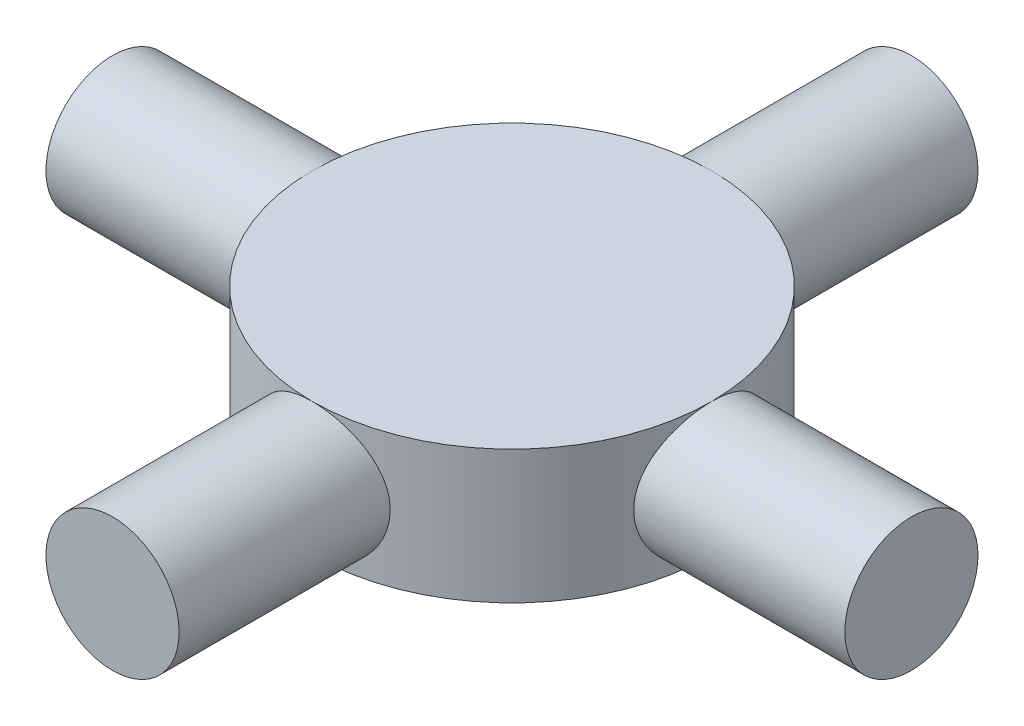
ISO-10303-21;
HEADER;
FILE_DESCRIPTION(('STEP AP214'),'2;1');
FILE_NAME('part.step','',(''),(''),'','','');
FILE_SCHEMA(('AUTOMOTIVE_DESIGN { 1 0 10303 214 1 1 1 1 }'));
ENDSEC;
DATA;
#1=APPLICATION_CONTEXT('core data for automotive mechanical design processes');
#2=APPLICATION_PROTOCOL_DEFINITION('international standard','automotive_design',2000,#1);
#3=PRODUCT_CONTEXT('',#1,'mechanical');
#4=PRODUCT('Part','Part','',(#3));
#5=PRODUCT_RELATED_PRODUCT_CATEGORY('part','',(#4));
#6=PRODUCT_DEFINITION_FORMATION('','',#4);
#7=PRODUCT_DEFINITION_CONTEXT('part definition',#1,'design');
#8=PRODUCT_DEFINITION('design','',#6,#7);
#9=PRODUCT_DEFINITION_SHAPE('','',#8);
#10=(LENGTH_UNIT() NAMED_UNIT(*) SI_UNIT(.MILLI.,.METRE.));
#11=(NAMED_UNIT(*) PLANE_ANGLE_UNIT() SI_UNIT($,.RADIAN.));
#12=(NAMED_UNIT(*) SI_UNIT($,.STERADIAN.) SOLID_ANGLE_UNIT());
#13=UNCERTAINTY_MEASURE_WITH_UNIT(LENGTH_MEASURE(1.E-05),#10,'distance_accuracy_value','');
#14=(GEOMETRIC_REPRESENTATION_CONTEXT(3) GLOBAL_UNCERTAINTY_ASSIGNED_CONTEXT((#13)) GLOBAL_UNIT_ASSIGNED_CONTEXT((#10,
#11,#12)) REPRESENTATION_CONTEXT('',''));
#15=CARTESIAN_POINT('',(0.,0.,0.));
#16=DIRECTION('',(0.,0.,1.));
#17=DIRECTION('',(1.,0.,0.));
#18=AXIS2_PLACEMENT_3D('',#15,#16,#17);
#19=CARTESIAN_POINT('',(0.,0.,60.));
#20=DIRECTION('',(0.,0.,-1.));
#21=DIRECTION('',(-1.,0.,0.));
#22=AXIS2_PLACEMENT_3D('',#19,#20,#21);
#23=CYLINDRICAL_SURFACE('',#22,5.);
#24=CARTESIAN_POINT('',(-5.,0.,15.8578643762691));
#25=CARTESIAN_POINT('',(-5.00000128973856,0.27234087418036,15.8578652734783));
#26=CARTESIAN_POINT('',(-4.97767391842761,0.544673999117963,15.8499115354571));
#27=CARTESIAN_POINT('',(-4.88925565844404,1.08127210497125,15.8191212959373));
#28=CARTESIAN_POINT('',(-4.82315756084198,1.34553574936235,15.7962823428906));
#29=CARTESIAN_POINT('',(-4.64977742842452,1.85813446498644,15.7385898155604));
#30=CARTESIAN_POINT('',(-4.54257610701623,2.10649964721358,15.7037598014339));
#31=CARTESIAN_POINT('',(-4.2903081422069,2.58180024273981,15.6260438994838));
#32=CARTESIAN_POINT('',(-4.14523314430091,2.80873091276816,15.5831562348194));
#33=CARTESIAN_POINT('',(-3.81525573221439,3.24359981169157,15.4922755296263));
#34=CARTESIAN_POINT('',(-3.62912170688959,3.45057714335864,15.4441552577678));
#35=CARTESIAN_POINT('',(-3.22493833607197,3.83103400612319,15.3493067599499));
#36=CARTESIAN_POINT('',(-3.00688387526188,4.00450815791185,15.3025787585519));
#37=CARTESIAN_POINT('',(-2.53802253982505,4.31739448664797,15.2143066539101));
#38=CARTESIAN_POINT('',(-2.28650955612262,4.45579985308979,15.1729296149197));
#39=CARTESIAN_POINT('',(-1.76215611493737,4.68795792563755,15.1015206614509));
#40=CARTESIAN_POINT('',(-1.48932142843606,4.78172266588453,15.0714856898499));
#41=CARTESIAN_POINT('',(-0.940144087167473,4.91867927316196,15.0270462284047));
#42=CARTESIAN_POINT('',(-0.664253774264843,4.96351723128503,15.012134261122));
#43=CARTESIAN_POINT('',(-0.108489374120448,5.0065814668033,14.9978195890876));
#44=CARTESIAN_POINT('',(0.171383667719481,5.00481975826206,14.9984128868552));
#45=CARTESIAN_POINT('',(0.715517575969073,4.95577872716986,15.0146980190634));
#46=CARTESIAN_POINT('',(0.979960242958282,4.91028735762756,15.0297967622441));
#47=CARTESIAN_POINT('',(1.49721719411086,4.77803509509764,15.0726516330134));
#48=CARTESIAN_POINT('',(1.75003068889608,4.69127140510087,15.1004086184409));
#49=CARTESIAN_POINT('',(2.24076237420986,4.4778934134697,15.1662164853388));
#50=CARTESIAN_POINT('',(2.47844110484422,4.35077030726744,15.2043978737992));
#51=CARTESIAN_POINT('',(2.92962162763661,4.06070147275672,15.287080348054));
#52=CARTESIAN_POINT('',(3.14311667192671,3.89774578336185,15.3315831899267));
#53=CARTESIAN_POINT('',(3.55050433275654,3.53162803270151,15.4246904075052));
#54=CARTESIAN_POINT('',(3.74300078532636,3.32693421079259,15.4733892415561));
#55=CARTESIAN_POINT('',(4.09138629799087,2.88775637136691,15.567633237555));
#56=CARTESIAN_POINT('',(4.24726971640771,2.65326777135978,15.6131779127192));
#57=CARTESIAN_POINT('',(4.51993727517871,2.1567318719828,15.6964737439444));
#58=CARTESIAN_POINT('',(4.6361323181067,1.89433934341113,15.7341045357626));
#59=CARTESIAN_POINT('',(4.82221596634668,1.35214302892791,15.7959174587808));
#60=CARTESIAN_POINT('',(4.89212397873747,1.07234659396877,15.8201052256454));
#61=CARTESIAN_POINT('',(4.98080641048761,0.516808222942129,15.8510181842207));
#62=CARTESIAN_POINT('',(5.00174547753816,0.241452876256721,15.8584819840622));
#63=CARTESIAN_POINT('',(4.99802719454859,-0.308880745570532,15.8571663970408));
#64=CARTESIAN_POINT('',(4.97337812613381,-0.583859080119941,15.8483899604093));
#65=CARTESIAN_POINT('',(4.88112825776155,-1.11578482855955,15.816319095485));
#66=CARTESIAN_POINT('',(4.81503196990342,-1.3730271507542,15.793533727958));
#67=CARTESIAN_POINT('',(4.64356931280233,-1.87271803119592,15.7365723164489));
#68=CARTESIAN_POINT('',(4.53819598181711,-2.1151639579539,15.702394253258));
#69=CARTESIAN_POINT('',(4.28737170369468,-2.58690210423499,15.6251561202107));
#70=CARTESIAN_POINT('',(4.14075559179248,-2.81553321320901,15.5818487167186));
#71=CARTESIAN_POINT('',(3.81292815278779,-3.24573026191859,15.4917115634517));
#72=CARTESIAN_POINT('',(3.63170662749391,-3.4472881933061,15.4448807778103));
#73=CARTESIAN_POINT('',(3.22945852950163,-3.82763992045319,15.3502480681075));
#74=CARTESIAN_POINT('',(3.00693635273326,-4.00487195009425,15.3025078211052));
#75=CARTESIAN_POINT('',(2.53413645700128,-4.31958071174021,15.2136574193446));
#76=CARTESIAN_POINT('',(2.28385972432276,-4.45705885581212,15.1725470291153));
#77=CARTESIAN_POINT('',(1.76389931216148,-4.68710052430857,15.1017797094699));
#78=CARTESIAN_POINT('',(1.49435561660598,-4.77995638574033,15.0720484997734));
#79=CARTESIAN_POINT('',(0.942292329230082,-4.91863871030052,15.0270694581113));
#80=CARTESIAN_POINT('',(0.659777459769448,-4.96448214940251,15.0118163982991));
#81=CARTESIAN_POINT('',(0.104076679300206,-5.00631038802821,14.9979068381872));
#82=CARTESIAN_POINT('',(-0.168923619600091,-5.00453726966188,14.998503995528));
#83=CARTESIAN_POINT('',(-0.710555725000868,-4.95671345926795,15.0143901740301));
#84=CARTESIAN_POINT('',(-0.979187884095283,-4.91066635923615,15.0296780033212));
#85=CARTESIAN_POINT('',(-1.50021059716029,-4.77708882712019,15.0729542522794));
#86=CARTESIAN_POINT('',(-1.75279135456394,-4.69022892323534,15.1007370819426));
#87=CARTESIAN_POINT('',(-2.23989175469898,-4.47811234451422,15.1661419647753));
#88=CARTESIAN_POINT('',(-2.47440812071216,-4.35284872401493,15.2037657975992));
#89=CARTESIAN_POINT('',(-2.92817008154393,-4.06215243948996,15.286706558606));
#90=CARTESIAN_POINT('',(-3.14653125778803,-3.8954065730918,15.3322563754037));
#91=CARTESIAN_POINT('',(-3.55290513136213,-3.52871304421903,15.425350560406));
#92=CARTESIAN_POINT('',(-3.74090810812296,-3.32875478868636,15.4728955613451));
#93=CARTESIAN_POINT('',(-4.08870904416559,-2.89195322206526,15.5668360087201));
#94=CARTESIAN_POINT('',(-4.2471148299895,-2.6539724451168,15.6131136005685));
#95=CARTESIAN_POINT('',(-4.52157171650557,-2.1533278654861,15.6969903338492));
#96=CARTESIAN_POINT('',(-4.63763388409737,-1.89067053485168,15.7345917419375));
#97=CARTESIAN_POINT('',(-4.81921914102083,-1.36019087992184,15.7949332896743));
#98=CARTESIAN_POINT('',(-4.8867895457476,-1.09313868237317,15.8182683571409));
#99=CARTESIAN_POINT('',(-4.97717160074633,-0.550719747666494,15.8497308230241));
#100=CARTESIAN_POINT('',(-4.99999869598296,-0.275355912946455,15.8578634691269));
#101=CARTESIAN_POINT('',(-5.,0.,15.8578643762691));
#102=B_SPLINE_CURVE_WITH_KNOTS('',3,(#24,#25,#26,#27,#28,#29,#30,#31,#32,#33,#34,#35,#36,#37,
#38,#39,#40,#41,#42,#43,#44,#45,#46,#47,#48,#49,#50,#51,#52,#53,#54,#55,#56,#57,#58,#59,#60,#61,
#62,#63,#64,#65,#66,#67,#68,#69,#70,#71,#72,#73,#74,#75,#76,#77,#78,#79,#80,#81,#82,#83,#84,#85,
#86,#87,#88,#89,#90,#91,#92,#93,#94,#95,#96,#97,#98,#99,#100,#101),.UNSPECIFIED.,.T.,.F.,(4,2,2,
2,2,2,2,2,2,2,2,2,2,2,2,2,2,2,2,2,2,2,2,2,2,2,2,2,2,2,2,2,2,2,2,2,2,2,4),(0.,0.816002923996779,
1.63214027507582,2.44668313750414,3.26140583092721,4.10506687137841,4.9488632585994,
5.81467530718285,6.68025381933945,7.51571593824671,8.35096266511636,9.15345024127845,
9.95599220946183,10.7690827430167,11.5823995937011,12.4340087181959,13.2857489806053,
14.1496319921528,15.0131525678308,15.837714568222,16.6621267918617,17.4582197884388,
18.2544539573473,19.0759428867857,19.8976742831064,20.7589404085546,21.6201759378766,
22.4756895595426,23.3308941502078,24.1459042338818,24.9608482004891,25.7628478020215,
26.5649925381621,27.3967759760317,28.2288252216316,29.0934451368072,29.9578389133433,
30.7831606081345,31.6081973595232),.UNSPECIFIED.);
#103=CARTESIAN_POINT('',(0.,-5.,15.));
#104=VERTEX_POINT('',#103);
#105=CARTESIAN_POINT('',(0.,5.,15.));
#106=VERTEX_POINT('',#105);
#107=EDGE_CURVE('E122',#104,#106,#102,.T.);
#108=ORIENTED_EDGE('',*,*,#107,.T.);
#109=EDGE_CURVE('E135',#106,#104,#102,.T.);
#110=ORIENTED_EDGE('',*,*,#109,.T.);
#111=EDGE_LOOP('',(#108,#110));
#112=FACE_BOUND('',#111,.T.);
#113=CARTESIAN_POINT('',(0.,0.,0.));
#114=DIRECTION('',(0.,0.,1.));
#115=DIRECTION('',(1.,0.,0.));
#116=AXIS2_PLACEMENT_3D('',#113,#114,#115);
#117=CIRCLE('',#116,5.);
#118=CARTESIAN_POINT('',(5.,0.,0.));
#119=VERTEX_POINT('',#118);
#120=EDGE_CURVE('E125',#119,#119,#117,.T.);
#121=ORIENTED_EDGE('',*,*,#120,.T.);
#122=EDGE_LOOP('',(#121));
#123=FACE_BOUND('',#122,.T.);
#124=ADVANCED_FACE('F34',(#112,#123),#23,.T.);
#125=CARTESIAN_POINT('',(0.,0.,0.));
#126=DIRECTION('',(0.,0.,1.));
#127=DIRECTION('',(1.,0.,0.));
#128=AXIS2_PLACEMENT_3D('',#125,#126,#127);
#129=PLANE('',#128);
#130=ORIENTED_EDGE('',*,*,#120,.F.);
#131=EDGE_LOOP('',(#130));
#132=FACE_BOUND('',#131,.T.);
#133=ADVANCED_FACE('F112',(#132),#129,.F.);
#134=CARTESIAN_POINT('',(0.,-5.,30.));
#135=DIRECTION('',(0.,1.,0.));
#136=DIRECTION('',(0.,0.,1.));
#137=AXIS2_PLACEMENT_3D('',#134,#135,#136);
#138=CYLINDRICAL_SURFACE('',#137,15.);
#139=ORIENTED_EDGE('',*,*,#109,.F.);
#140=CARTESIAN_POINT('',(0.,5.,30.));
#141=DIRECTION('',(0.,1.,0.));
#142=DIRECTION('',(0.,0.,1.));
#143=AXIS2_PLACEMENT_3D('',#140,#141,#142);
#144=CIRCLE('',#143,15.);
#145=CARTESIAN_POINT('',(15.,5.,30.));
#146=VERTEX_POINT('',#145);
#147=EDGE_CURVE('E53',#146,#106,#144,.T.);
#148=ORIENTED_EDGE('',*,*,#147,.F.);
#149=CARTESIAN_POINT('',(14.142135623731,0.,25.));
#150=CARTESIAN_POINT('',(14.1421347265217,-0.272340874180355,24.9999987102614));
#151=CARTESIAN_POINT('',(14.1500884645429,-0.544673999117958,25.0223260815724));
#152=CARTESIAN_POINT('',(14.1808787040627,-1.08127210497124,25.110744341556));
#153=CARTESIAN_POINT('',(14.2037176571094,-1.34553574936234,25.176842439158));
#154=CARTESIAN_POINT('',(14.2614101844396,-1.85813446498643,25.3502225715755));
#155=CARTESIAN_POINT('',(14.2962401985661,-2.10649964721358,25.4574238929838));
#156=CARTESIAN_POINT('',(14.3739561005162,-2.5818002427398,25.7096918577931));
#157=CARTESIAN_POINT('',(14.4168437651806,-2.80873091276815,25.8547668556991));
#158=CARTESIAN_POINT('',(14.5077244703737,-3.24359981169156,26.1847442677856));
#159=CARTESIAN_POINT('',(14.5558447422322,-3.45057714335863,26.3708782931104));
#160=CARTESIAN_POINT('',(14.6506932400501,-3.83103400612319,26.775061663928));
#161=CARTESIAN_POINT('',(14.6974212414481,-4.00450815791184,26.9931161247381));
#162=CARTESIAN_POINT('',(14.7856933460899,-4.31739448664796,27.4619774601749));
#163=CARTESIAN_POINT('',(14.8270703850803,-4.45579985308978,27.7134904438774));
#164=CARTESIAN_POINT('',(14.8984793385491,-4.68795792563754,28.2378438850626));
#165=CARTESIAN_POINT('',(14.9285143101501,-4.78172266588452,28.5106785715639));
#166=CARTESIAN_POINT('',(14.9729537715953,-4.91867927316196,29.0598559128325));
#167=CARTESIAN_POINT('',(14.987865738878,-4.96351723128503,29.3357462257352));
#168=CARTESIAN_POINT('',(15.0021804109124,-5.00658146680329,29.8915106258795));
#169=CARTESIAN_POINT('',(15.0015871131448,-5.00481975826206,30.1713836677195));
#170=CARTESIAN_POINT('',(14.9853019809366,-4.95577872716985,30.7155175759691));
#171=CARTESIAN_POINT('',(14.9702032377559,-4.91028735762755,30.9799602429583));
#172=CARTESIAN_POINT('',(14.9273483669866,-4.77803509509763,31.4972171941109));
#173=CARTESIAN_POINT('',(14.8995913815591,-4.69127140510087,31.7500306888961));
#174=CARTESIAN_POINT('',(14.8337835146612,-4.4778934134697,32.2407623742099));
#175=CARTESIAN_POINT('',(14.7956021262008,-4.35077030726744,32.4784411048442));
#176=CARTESIAN_POINT('',(14.712919651946,-4.06070147275671,32.9296216276366));
#177=CARTESIAN_POINT('',(14.6684168100733,-3.89774578336184,33.1431166719267));
#178=CARTESIAN_POINT('',(14.5753095924948,-3.5316280327015,33.5505043327565));
#179=CARTESIAN_POINT('',(14.5266107584439,-3.32693421079259,33.7430007853264));
#180=CARTESIAN_POINT('',(14.432366762445,-2.8877563713669,34.0913862979909));
#181=CARTESIAN_POINT('',(14.3868220872808,-2.65326777135977,34.2472697164077));
#182=CARTESIAN_POINT('',(14.3035262560556,-2.1567318719828,34.5199372751787));
#183=CARTESIAN_POINT('',(14.2658954642374,-1.89433934341113,34.6361323181067));
#184=CARTESIAN_POINT('',(14.2040825412192,-1.35214302892791,34.8222159663467));
#185=CARTESIAN_POINT('',(14.1798947743546,-1.07234659396877,34.8921239787375));
#186=CARTESIAN_POINT('',(14.1489818157793,-0.516808222942124,34.9808064104876));
#187=CARTESIAN_POINT('',(14.1415180159378,-0.241452876256715,35.0017454775382));
#188=CARTESIAN_POINT('',(14.1428336029592,0.308880745570538,34.9980271945486));
#189=CARTESIAN_POINT('',(14.1516100395907,0.583859080119946,34.9733781261338));
#190=CARTESIAN_POINT('',(14.183680904515,1.11578482855955,34.8811282577615));
#191=CARTESIAN_POINT('',(14.206466272042,1.37302715075421,34.8150319699034));
#192=CARTESIAN_POINT('',(14.2634276835511,1.87271803119593,34.6435693128023));
#193=CARTESIAN_POINT('',(14.297605746742,2.11516395795391,34.5381959818171));
#194=CARTESIAN_POINT('',(14.3748438797893,2.58690210423499,34.2873717036947));
#195=CARTESIAN_POINT('',(14.4181512832814,2.81553321320901,34.1407555917925));
#196=CARTESIAN_POINT('',(14.5082884365483,3.2457302619186,33.8129281527878));
#197=CARTESIAN_POINT('',(14.5551192221897,3.4472881933061,33.6317066274939));
#198=CARTESIAN_POINT('',(14.6497519318924,3.8276399204532,33.2294585295016));
#199=CARTESIAN_POINT('',(14.6974921788948,4.00487195009425,33.0069363527333));
#200=CARTESIAN_POINT('',(14.7863425806554,4.31958071174022,32.5341364570013));
#201=CARTESIAN_POINT('',(14.8274529708847,4.45705885581213,32.2838597243228));
#202=CARTESIAN_POINT('',(14.8982202905301,4.68710052430858,31.7638993121615));
#203=CARTESIAN_POINT('',(14.9279515002266,4.77995638574033,31.494355616606));
#204=CARTESIAN_POINT('',(14.9729305418887,4.91863871030053,30.9422923292301));
#205=CARTESIAN_POINT('',(14.9881836017009,4.96448214940252,30.6597774597694));
#206=CARTESIAN_POINT('',(15.0020931618128,5.00631038802822,30.1040766793002));
#207=CARTESIAN_POINT('',(15.001496004472,5.00453726966189,29.8310763803999));
#208=CARTESIAN_POINT('',(14.9856098259699,4.95671345926796,29.2894442749991));
#209=CARTESIAN_POINT('',(14.9703219966788,4.91066635923616,29.0208121159047));
#210=CARTESIAN_POINT('',(14.9270457477206,4.77708882712019,28.4997894028397));
#211=CARTESIAN_POINT('',(14.8992629180574,4.69022892323534,28.2472086454361));
#212=CARTESIAN_POINT('',(14.8338580352247,4.47811234451423,27.760108245301));
#213=CARTESIAN_POINT('',(14.7962342024008,4.35284872401494,27.5255918792878));
#214=CARTESIAN_POINT('',(14.713293441394,4.06215243948997,27.0718299184561));
#215=CARTESIAN_POINT('',(14.6677436245963,3.8954065730918,26.853468742212));
#216=CARTESIAN_POINT('',(14.574649439594,3.52871304421903,26.4470948686379));
#217=CARTESIAN_POINT('',(14.5271044386549,3.32875478868637,26.259091891877));
#218=CARTESIAN_POINT('',(14.4331639912799,2.89195322206526,25.9112909558344));
#219=CARTESIAN_POINT('',(14.3868863994315,2.65397244511681,25.7528851700105));
#220=CARTESIAN_POINT('',(14.3030096661508,2.15332786548611,25.4784282834944));
#221=CARTESIAN_POINT('',(14.2654082580625,1.89067053485168,25.3623661159026));
#222=CARTESIAN_POINT('',(14.2050667103257,1.36019087992184,25.1807808589792));
#223=CARTESIAN_POINT('',(14.1817316428591,1.09313868237317,25.1132104542524));
#224=CARTESIAN_POINT('',(14.1502691769759,0.550719747666498,25.0228283992537));
#225=CARTESIAN_POINT('',(14.1421365308731,0.27535591294646,25.000001304017));
#226=CARTESIAN_POINT('',(14.142135623731,0.,25.));
#227=B_SPLINE_CURVE_WITH_KNOTS('',3,(#149,#150,#151,#152,#153,#154,#155,#156,#157,#158,#159,
#160,#161,#162,#163,#164,#165,#166,#167,#168,#169,#170,#171,#172,#173,#174,#175,#176,#177,#178,
#179,#180,#181,#182,#183,#184,#185,#186,#187,#188,#189,#190,#191,#192,#193,#194,#195,#196,#197,
#198,#199,#200,#201,#202,#203,#204,#205,#206,#207,#208,#209,#210,#211,#212,#213,#214,#215,#216,
#217,#218,#219,#220,#221,#222,#223,#224,#225,#226),.UNSPECIFIED.,.T.,.F.,(4,2,2,2,2,2,2,2,2,2,2,
2,2,2,2,2,2,2,2,2,2,2,2,2,2,2,2,2,2,2,2,2,2,2,2,2,2,2,4),(0.,0.816002923996779,1.63214027507582,
2.44668313750414,3.26140583092721,4.1050668713784,4.9488632585994,5.81467530718285,
6.68025381933945,7.51571593824671,8.35096266511636,9.15345024127845,9.95599220946183,
10.7690827430168,11.5823995937011,12.4340087181959,13.2857489806053,14.1496319921528,
15.0131525678308,15.837714568222,16.6621267918617,17.4582197884388,18.2544539573473,
19.0759428867857,19.8976742831064,20.7589404085546,21.6201759378766,22.4756895595426,
23.3308941502078,24.1459042338818,24.9608482004891,25.7628478020215,26.5649925381621,
27.3967759760317,28.2288252216316,29.0934451368072,29.9578389133433,30.7831606081345,
31.6081973595232),.UNSPECIFIED.);
#228=CARTESIAN_POINT('',(15.,-5.,30.));
#229=VERTEX_POINT('',#228);
#230=EDGE_CURVE('E159',#146,#229,#227,.T.);
#231=ORIENTED_EDGE('',*,*,#230,.T.);
#232=CARTESIAN_POINT('',(0.,-5.,30.));
#233=DIRECTION('',(0.,1.,0.));
#234=DIRECTION('',(0.,0.,1.));
#235=AXIS2_PLACEMENT_3D('',#232,#233,#234);
#236=CIRCLE('',#235,15.);
#237=EDGE_CURVE('E189',#229,#104,#236,.T.);
#238=ORIENTED_EDGE('',*,*,#237,.T.);
#239=EDGE_LOOP('',(#139,#148,#231,#238));
#240=FACE_BOUND('',#239,.T.);
#241=ADVANCED_FACE('F117',(#240),#138,.T.);
#242=ORIENTED_EDGE('',*,*,#107,.F.);
#243=CARTESIAN_POINT('',(-15.0000000000004,-5.00000000000133,30.0000000000001));
#244=VERTEX_POINT('',#243);
#245=EDGE_CURVE('E185',#104,#244,#236,.T.);
#246=ORIENTED_EDGE('',*,*,#245,.T.);
#247=CARTESIAN_POINT('',(-14.142135623731,0.,25.));
#248=CARTESIAN_POINT('',(-14.1421347265217,0.272340874180365,24.9999987102614));
#249=CARTESIAN_POINT('',(-14.1500884645429,0.544673999117969,25.0223260815724));
#250=CARTESIAN_POINT('',(-14.1808787040627,1.08127210497125,25.110744341556));
#251=CARTESIAN_POINT('',(-14.2037176571094,1.34553574936235,25.176842439158));
#252=CARTESIAN_POINT('',(-14.2614101844396,1.85813446498644,25.3502225715755));
#253=CARTESIAN_POINT('',(-14.2962401985661,2.10649964721359,25.4574238929838));
#254=CARTESIAN_POINT('',(-14.3739561005162,2.58180024273981,25.7096918577931));
#255=CARTESIAN_POINT('',(-14.4168437651806,2.80873091276816,25.8547668556991));
#256=CARTESIAN_POINT('',(-14.5077244703737,3.24359981169157,26.1847442677856));
#257=CARTESIAN_POINT('',(-14.5558447422322,3.45057714335864,26.3708782931104));
#258=CARTESIAN_POINT('',(-14.6506932400501,3.8310340061232,26.775061663928));
#259=CARTESIAN_POINT('',(-14.6974212414481,4.00450815791185,26.9931161247381));
#260=CARTESIAN_POINT('',(-14.7856933460899,4.31739448664797,27.4619774601749));
#261=CARTESIAN_POINT('',(-14.8270703850803,4.45579985308979,27.7134904438774));
#262=CARTESIAN_POINT('',(-14.8984793385491,4.68795792563755,28.2378438850626));
#263=CARTESIAN_POINT('',(-14.9285143101501,4.78172266588453,28.5106785715639));
#264=CARTESIAN_POINT('',(-14.9729537715953,4.91867927316197,29.0598559128325));
#265=CARTESIAN_POINT('',(-14.987865738878,4.96351723128504,29.3357462257352));
#266=CARTESIAN_POINT('',(-15.0021804109124,5.0065814668033,29.8915106258795));
#267=CARTESIAN_POINT('',(-15.0015871131448,5.00481975826207,30.1713836677195));
#268=CARTESIAN_POINT('',(-14.9853019809366,4.95577872716986,30.7155175759691));
#269=CARTESIAN_POINT('',(-14.9702032377559,4.91028735762756,30.9799602429583));
#270=CARTESIAN_POINT('',(-14.9273483669866,4.77803509509764,31.4972171941109));
#271=CARTESIAN_POINT('',(-14.8995913815591,4.69127140510088,31.7500306888961));
#272=CARTESIAN_POINT('',(-14.8337835146612,4.47789341346971,32.2407623742099));
#273=CARTESIAN_POINT('',(-14.7956021262008,4.35077030726745,32.4784411048442));
#274=CARTESIAN_POINT('',(-14.712919651946,4.06070147275672,32.9296216276366));
#275=CARTESIAN_POINT('',(-14.6684168100733,3.89774578336185,33.1431166719267));
#276=CARTESIAN_POINT('',(-14.5753095924948,3.53162803270151,33.5505043327565));
#277=CARTESIAN_POINT('',(-14.5266107584439,3.3269342107926,33.7430007853264));
#278=CARTESIAN_POINT('',(-14.432366762445,2.88775637136691,34.0913862979909));
#279=CARTESIAN_POINT('',(-14.3868220872808,2.65326777135978,34.2472697164077));
#280=CARTESIAN_POINT('',(-14.3035262560556,2.15673187198281,34.5199372751787));
#281=CARTESIAN_POINT('',(-14.2658954642374,1.89433934341114,34.6361323181067));
#282=CARTESIAN_POINT('',(-14.2040825412192,1.35214302892792,34.8222159663467));
#283=CARTESIAN_POINT('',(-14.1798947743546,1.07234659396878,34.8921239787375));
#284=CARTESIAN_POINT('',(-14.1489818157793,0.516808222942135,34.9808064104876));
#285=CARTESIAN_POINT('',(-14.1415180159378,0.241452876256726,35.0017454775382));
#286=CARTESIAN_POINT('',(-14.1428336029592,-0.308880745570528,34.9980271945486));
#287=CARTESIAN_POINT('',(-14.1516100395907,-0.583859080119936,34.9733781261338));
#288=CARTESIAN_POINT('',(-14.183680904515,-1.11578482855954,34.8811282577615));
#289=CARTESIAN_POINT('',(-14.206466272042,-1.3730271507542,34.8150319699034));
#290=CARTESIAN_POINT('',(-14.2634276835511,-1.87271803119592,34.6435693128023));
#291=CARTESIAN_POINT('',(-14.297605746742,-2.1151639579539,34.5381959818171));
#292=CARTESIAN_POINT('',(-14.3748438797893,-2.58690210423498,34.2873717036947));
#293=CARTESIAN_POINT('',(-14.4181512832814,-2.815533213209,34.1407555917925));
#294=CARTESIAN_POINT('',(-14.5082884365483,-3.24573026191859,33.8129281527878));
#295=CARTESIAN_POINT('',(-14.5551192221897,-3.44728819330609,33.6317066274939));
#296=CARTESIAN_POINT('',(-14.6497519318924,-3.82763992045319,33.2294585295016));
#297=CARTESIAN_POINT('',(-14.6974921788948,-4.00487195009424,33.0069363527333));
#298=CARTESIAN_POINT('',(-14.7863425806554,-4.31958071174021,32.5341364570013));
#299=CARTESIAN_POINT('',(-14.8274529708847,-4.45705885581212,32.2838597243228));
#300=CARTESIAN_POINT('',(-14.8982202905301,-4.68710052430857,31.7638993121615));
#301=CARTESIAN_POINT('',(-14.9279515002266,-4.77995638574032,31.494355616606));
#302=CARTESIAN_POINT('',(-14.9729305418887,-4.91863871030052,30.9422923292301));
#303=CARTESIAN_POINT('',(-14.9881836017009,-4.96448214940251,30.6597774597694));
#304=CARTESIAN_POINT('',(-15.0020931618128,-5.00631038802821,30.1040766793002));
#305=CARTESIAN_POINT('',(-15.001496004472,-5.00453726966188,29.8310763803999));
#306=CARTESIAN_POINT('',(-14.9856098259699,-4.95671345926795,29.2894442749991));
#307=CARTESIAN_POINT('',(-14.9703219966788,-4.91066635923615,29.0208121159047));
#308=CARTESIAN_POINT('',(-14.9270457477206,-4.77708882712018,28.4997894028397));
#309=CARTESIAN_POINT('',(-14.8992629180574,-4.69022892323533,28.2472086454361));
#310=CARTESIAN_POINT('',(-14.8338580352247,-4.47811234451422,27.760108245301));
#311=CARTESIAN_POINT('',(-14.7962342024008,-4.35284872401493,27.5255918792878));
#312=CARTESIAN_POINT('',(-14.713293441394,-4.06215243948996,27.0718299184561));
#313=CARTESIAN_POINT('',(-14.6677436245963,-3.89540657309179,26.853468742212));
#314=CARTESIAN_POINT('',(-14.574649439594,-3.52871304421902,26.4470948686379));
#315=CARTESIAN_POINT('',(-14.5271044386549,-3.32875478868636,26.259091891877));
#316=CARTESIAN_POINT('',(-14.4331639912799,-2.89195322206525,25.9112909558344));
#317=CARTESIAN_POINT('',(-14.3868863994315,-2.65397244511679,25.7528851700105));
#318=CARTESIAN_POINT('',(-14.3030096661508,-2.1533278654861,25.4784282834944));
#319=CARTESIAN_POINT('',(-14.2654082580625,-1.89067053485167,25.3623661159026));
#320=CARTESIAN_POINT('',(-14.2050667103257,-1.36019087992183,25.1807808589792));
#321=CARTESIAN_POINT('',(-14.1817316428591,-1.09313868237316,25.1132104542524));
#322=CARTESIAN_POINT('',(-14.1502691769759,-0.550719747666487,25.0228283992537));
#323=CARTESIAN_POINT('',(-14.1421365308731,-0.275355912946449,25.000001304017));
#324=CARTESIAN_POINT('',(-14.142135623731,0.,25.));
#325=B_SPLINE_CURVE_WITH_KNOTS('',3,(#247,#248,#249,#250,#251,#252,#253,#254,#255,#256,#257,
#258,#259,#260,#261,#262,#263,#264,#265,#266,#267,#268,#269,#270,#271,#272,#273,#274,#275,#276,
#277,#278,#279,#280,#281,#282,#283,#284,#285,#286,#287,#288,#289,#290,#291,#292,#293,#294,#295,
#296,#297,#298,#299,#300,#301,#302,#303,#304,#305,#306,#307,#308,#309,#310,#311,#312,#313,#314,
#315,#316,#317,#318,#319,#320,#321,#322,#323,#324),.UNSPECIFIED.,.T.,.F.,(4,2,2,2,2,2,2,2,2,2,2,
2,2,2,2,2,2,2,2,2,2,2,2,2,2,2,2,2,2,2,2,2,2,2,2,2,2,2,4),(0.,0.816002923996779,1.63214027507582,
2.44668313750414,3.26140583092721,4.1050668713784,4.9488632585994,5.81467530718285,
6.68025381933945,7.51571593824671,8.35096266511636,9.15345024127845,9.95599220946183,
10.7690827430168,11.5823995937011,12.4340087181959,13.2857489806053,14.1496319921528,
15.0131525678308,15.837714568222,16.6621267918617,17.4582197884388,18.2544539573473,
19.0759428867857,19.8976742831064,20.7589404085546,21.6201759378766,22.4756895595426,
23.3308941502078,24.1459042338818,24.9608482004891,25.7628478020215,26.5649925381621,
27.3967759760317,28.2288252216316,29.0934451368072,29.9578389133433,30.7831606081345,
31.6081973595232),.UNSPECIFIED.);
#326=CARTESIAN_POINT('',(-15.,5.,30.));
#327=VERTEX_POINT('',#326);
#328=EDGE_CURVE('E60',#244,#327,#325,.T.);
#329=ORIENTED_EDGE('',*,*,#328,.T.);
#330=EDGE_CURVE('E93',#106,#327,#144,.T.);
#331=ORIENTED_EDGE('',*,*,#330,.F.);
#332=EDGE_LOOP('',(#242,#246,#329,#331));
#333=FACE_BOUND('',#332,.T.);
#334=ADVANCED_FACE('F150',(#333),#138,.T.);
#335=CARTESIAN_POINT('',(0.,5.,45.));
#336=VERTEX_POINT('',#335);
#337=EDGE_CURVE('E84',#327,#336,#144,.T.);
#338=ORIENTED_EDGE('',*,*,#337,.F.);
#339=EDGE_CURVE('E140',#327,#244,#325,.T.);
#340=ORIENTED_EDGE('',*,*,#339,.T.);
#341=CARTESIAN_POINT('',(0.,-5.,45.));
#342=VERTEX_POINT('',#341);
#343=EDGE_CURVE('E86',#244,#342,#236,.T.);
#344=ORIENTED_EDGE('',*,*,#343,.T.);
#345=CARTESIAN_POINT('',(-5.,0.,44.142135623731));
#346=CARTESIAN_POINT('',(-5.00000128973856,-0.27234087418036,44.1421347265217));
#347=CARTESIAN_POINT('',(-4.97767391842761,-0.544673999117964,44.1500884645429));
#348=CARTESIAN_POINT('',(-4.88925565844404,-1.08127210497125,44.1808787040627));
#349=CARTESIAN_POINT('',(-4.82315756084198,-1.34553574936235,44.2037176571094));
#350=CARTESIAN_POINT('',(-4.64977742842452,-1.85813446498644,44.2614101844396));
#351=CARTESIAN_POINT('',(-4.54257610701623,-2.10649964721358,44.2962401985661));
#352=CARTESIAN_POINT('',(-4.2903081422069,-2.5818002427398,44.3739561005162));
#353=CARTESIAN_POINT('',(-4.14523314430092,-2.80873091276815,44.4168437651806));
#354=CARTESIAN_POINT('',(-3.81525573221439,-3.24359981169157,44.5077244703737));
#355=CARTESIAN_POINT('',(-3.6291217068896,-3.45057714335864,44.5558447422322));
#356=CARTESIAN_POINT('',(-3.22493833607198,-3.83103400612319,44.6506932400501));
#357=CARTESIAN_POINT('',(-3.00688387526188,-4.00450815791185,44.6974212414481));
#358=CARTESIAN_POINT('',(-2.53802253982505,-4.31739448664796,44.7856933460899));
#359=CARTESIAN_POINT('',(-2.28650955612263,-4.45579985308979,44.8270703850803));
#360=CARTESIAN_POINT('',(-1.76215611493737,-4.68795792563755,44.8984793385491));
#361=CARTESIAN_POINT('',(-1.48932142843606,-4.78172266588453,44.9285143101501));
#362=CARTESIAN_POINT('',(-0.940144087167472,-4.91867927316197,44.9729537715953));
#363=CARTESIAN_POINT('',(-0.664253774264842,-4.96351723128503,44.987865738878));
#364=CARTESIAN_POINT('',(-0.108489374120448,-5.0065814668033,45.0021804109124));
#365=CARTESIAN_POINT('',(0.171383667719481,-5.00481975826206,45.0015871131448));
#366=CARTESIAN_POINT('',(0.715517575969072,-4.95577872716986,44.9853019809366));
#367=CARTESIAN_POINT('',(0.979960242958281,-4.91028735762756,44.9702032377559));
#368=CARTESIAN_POINT('',(1.49721719411086,-4.77803509509764,44.9273483669866));
#369=CARTESIAN_POINT('',(1.75003068889608,-4.69127140510087,44.8995913815591));
#370=CARTESIAN_POINT('',(2.24076237420986,-4.4778934134697,44.8337835146612));
#371=CARTESIAN_POINT('',(2.47844110484423,-4.35077030726744,44.7956021262008));
#372=CARTESIAN_POINT('',(2.92962162763661,-4.06070147275672,44.712919651946));
#373=CARTESIAN_POINT('',(3.14311667192671,-3.89774578336185,44.6684168100733));
#374=CARTESIAN_POINT('',(3.55050433275654,-3.53162803270151,44.5753095924948));
#375=CARTESIAN_POINT('',(3.74300078532636,-3.32693421079259,44.5266107584439));
#376=CARTESIAN_POINT('',(4.09138629799087,-2.88775637136691,44.432366762445));
#377=CARTESIAN_POINT('',(4.24726971640771,-2.65326777135978,44.3868220872808));
#378=CARTESIAN_POINT('',(4.51993727517871,-2.1567318719828,44.3035262560556));
#379=CARTESIAN_POINT('',(4.6361323181067,-1.89433934341113,44.2658954642374));
#380=CARTESIAN_POINT('',(4.82221596634668,-1.35214302892791,44.2040825412192));
#381=CARTESIAN_POINT('',(4.89212397873747,-1.07234659396877,44.1798947743546));
#382=CARTESIAN_POINT('',(4.98080641048761,-0.516808222942128,44.1489818157792));
#383=CARTESIAN_POINT('',(5.00174547753816,-0.241452876256719,44.1415180159378));
#384=CARTESIAN_POINT('',(4.99802719454859,0.308880745570535,44.1428336029592));
#385=CARTESIAN_POINT('',(4.97337812613381,0.583859080119943,44.1516100395907));
#386=CARTESIAN_POINT('',(4.88112825776155,1.11578482855955,44.183680904515));
#387=CARTESIAN_POINT('',(4.81503196990342,1.37302715075421,44.206466272042));
#388=CARTESIAN_POINT('',(4.64356931280233,1.87271803119592,44.2634276835511));
#389=CARTESIAN_POINT('',(4.53819598181711,2.1151639579539,44.297605746742));
#390=CARTESIAN_POINT('',(4.28737170369468,2.58690210423499,44.3748438797893));
#391=CARTESIAN_POINT('',(4.14075559179248,2.81553321320901,44.4181512832814));
#392=CARTESIAN_POINT('',(3.81292815278779,3.24573026191859,44.5082884365483));
#393=CARTESIAN_POINT('',(3.63170662749391,3.4472881933061,44.5551192221897));
#394=CARTESIAN_POINT('',(3.22945852950163,3.82763992045319,44.6497519318924));
#395=CARTESIAN_POINT('',(3.00693635273326,4.00487195009425,44.6974921788948));
#396=CARTESIAN_POINT('',(2.53413645700128,4.31958071174022,44.7863425806554));
#397=CARTESIAN_POINT('',(2.28385972432276,4.45705885581212,44.8274529708847));
#398=CARTESIAN_POINT('',(1.76389931216148,4.68710052430858,44.8982202905301));
#399=CARTESIAN_POINT('',(1.49435561660598,4.77995638574033,44.9279515002265));
#400=CARTESIAN_POINT('',(0.942292329230081,4.91863871030052,44.9729305418887));
#401=CARTESIAN_POINT('',(0.659777459769447,4.96448214940251,44.9881836017009));
#402=CARTESIAN_POINT('',(0.104076679300205,5.00631038802821,45.0020931618128));
#403=CARTESIAN_POINT('',(-0.168923619600092,5.00453726966188,45.001496004472));
#404=CARTESIAN_POINT('',(-0.710555725000868,4.95671345926795,44.9856098259699));
#405=CARTESIAN_POINT('',(-0.979187884095283,4.91066635923615,44.9703219966788));
#406=CARTESIAN_POINT('',(-1.50021059716029,4.77708882712019,44.9270457477206));
#407=CARTESIAN_POINT('',(-1.75279135456395,4.69022892323533,44.8992629180574));
#408=CARTESIAN_POINT('',(-2.23989175469898,4.47811234451422,44.8338580352247));
#409=CARTESIAN_POINT('',(-2.47440812071216,4.35284872401493,44.7962342024008));
#410=CARTESIAN_POINT('',(-2.92817008154393,4.06215243948996,44.7132934413941));
#411=CARTESIAN_POINT('',(-3.14653125778803,3.8954065730918,44.6677436245963));
#412=CARTESIAN_POINT('',(-3.55290513136213,3.52871304421903,44.574649439594));
#413=CARTESIAN_POINT('',(-3.74090810812296,3.32875478868636,44.5271044386549));
#414=CARTESIAN_POINT('',(-4.08870904416559,2.89195322206526,44.4331639912799));
#415=CARTESIAN_POINT('',(-4.2471148299895,2.6539724451168,44.3868863994315));
#416=CARTESIAN_POINT('',(-4.52157171650557,2.1533278654861,44.3030096661508));
#417=CARTESIAN_POINT('',(-4.63763388409737,1.89067053485168,44.2654082580625));
#418=CARTESIAN_POINT('',(-4.81921914102083,1.36019087992184,44.2050667103257));
#419=CARTESIAN_POINT('',(-4.8867895457476,1.09313868237317,44.1817316428591));
#420=CARTESIAN_POINT('',(-4.97717160074633,0.550719747666493,44.1502691769759));
#421=CARTESIAN_POINT('',(-4.99999869598296,0.275355912946455,44.1421365308731));
#422=CARTESIAN_POINT('',(-5.,0.,44.142135623731));
#423=B_SPLINE_CURVE_WITH_KNOTS('',3,(#345,#346,#347,#348,#349,#350,#351,#352,#353,#354,#355,
#356,#357,#358,#359,#360,#361,#362,#363,#364,#365,#366,#367,#368,#369,#370,#371,#372,#373,#374,
#375,#376,#377,#378,#379,#380,#381,#382,#383,#384,#385,#386,#387,#388,#389,#390,#391,#392,#393,
#394,#395,#396,#397,#398,#399,#400,#401,#402,#403,#404,#405,#406,#407,#408,#409,#410,#411,#412,
#413,#414,#415,#416,#417,#418,#419,#420,#421,#422),.UNSPECIFIED.,.T.,.F.,(4,2,2,2,2,2,2,2,2,2,2,
2,2,2,2,2,2,2,2,2,2,2,2,2,2,2,2,2,2,2,2,2,2,2,2,2,2,2,4),(0.,0.816002923996779,1.63214027507582,
2.44668313750414,3.26140583092721,4.1050668713784,4.9488632585994,5.81467530718286,
6.68025381933945,7.51571593824671,8.35096266511636,9.15345024127845,9.95599220946183,
10.7690827430167,11.5823995937011,12.4340087181959,13.2857489806053,14.1496319921528,
15.0131525678308,15.837714568222,16.6621267918617,17.4582197884388,18.2544539573473,
19.0759428867857,19.8976742831064,20.7589404085546,21.6201759378766,22.4756895595426,
23.3308941502078,24.1459042338818,24.9608482004891,25.7628478020215,26.5649925381621,
27.3967759760317,28.2288252216316,29.0934451368072,29.9578389133433,30.7831606081345,
31.6081973595232),.UNSPECIFIED.);
#424=EDGE_CURVE('E38',#336,#342,#423,.T.);
#425=ORIENTED_EDGE('',*,*,#424,.F.);
#426=EDGE_LOOP('',(#338,#340,#344,#425));
#427=FACE_BOUND('',#426,.T.);
#428=ADVANCED_FACE('F83',(#427),#138,.T.);
#429=EDGE_CURVE('E165',#342,#229,#236,.T.);
#430=ORIENTED_EDGE('',*,*,#429,.T.);
#431=EDGE_CURVE('E99',#229,#146,#227,.T.);
#432=ORIENTED_EDGE('',*,*,#431,.T.);
#433=EDGE_CURVE('E92',#336,#146,#144,.T.);
#434=ORIENTED_EDGE('',*,*,#433,.F.);
#435=EDGE_CURVE('E11',#342,#336,#423,.T.);
#436=ORIENTED_EDGE('',*,*,#435,.F.);
#437=EDGE_LOOP('',(#430,#432,#434,#436));
#438=FACE_BOUND('',#437,.T.);
#439=ADVANCED_FACE('F98',(#438),#138,.T.);
#440=CARTESIAN_POINT('',(0.,-5.,30.));
#441=DIRECTION('',(0.,1.,0.));
#442=DIRECTION('',(0.,0.,1.));
#443=AXIS2_PLACEMENT_3D('',#440,#441,#442);
#444=PLANE('',#443);
#445=ORIENTED_EDGE('',*,*,#245,.F.);
#446=ORIENTED_EDGE('',*,*,#237,.F.);
#447=ORIENTED_EDGE('',*,*,#429,.F.);
#448=ORIENTED_EDGE('',*,*,#343,.F.);
#449=EDGE_LOOP('',(#445,#446,#447,#448));
#450=FACE_BOUND('',#449,.T.);
#451=ADVANCED_FACE('F152',(#450),#444,.F.);
#452=CARTESIAN_POINT('',(0.,5.,30.));
#453=DIRECTION('',(0.,1.,0.));
#454=DIRECTION('',(0.,0.,1.));
#455=AXIS2_PLACEMENT_3D('',#452,#453,#454);
#456=PLANE('',#455);
#457=ORIENTED_EDGE('',*,*,#147,.T.);
#458=ORIENTED_EDGE('',*,*,#330,.T.);
#459=ORIENTED_EDGE('',*,*,#337,.T.);
#460=ORIENTED_EDGE('',*,*,#433,.T.);
#461=EDGE_LOOP('',(#457,#458,#459,#460));
#462=FACE_BOUND('',#461,.T.);
#463=ADVANCED_FACE('F91',(#462),#456,.T.);
#464=CARTESIAN_POINT('',(30.,0.,30.));
#465=DIRECTION('',(1.,0.,0.));
#466=DIRECTION('',(0.,0.,-1.));
#467=AXIS2_PLACEMENT_3D('',#464,#465,#466);
#468=PLANE('',#467);
#469=CARTESIAN_POINT('',(30.,0.,30.));
#470=DIRECTION('',(1.,0.,0.));
#471=DIRECTION('',(0.,0.,-1.));
#472=AXIS2_PLACEMENT_3D('',#469,#470,#471);
#473=CIRCLE('',#472,5.);
#474=CARTESIAN_POINT('',(30.,0.,25.));
#475=VERTEX_POINT('',#474);
#476=EDGE_CURVE('E130',#475,#475,#473,.T.);
#477=ORIENTED_EDGE('',*,*,#476,.T.);
#478=EDGE_LOOP('',(#477));
#479=FACE_BOUND('',#478,.T.);
#480=ADVANCED_FACE('F154',(#479),#468,.T.);
#481=CARTESIAN_POINT('',(-30.,0.,30.));
#482=DIRECTION('',(1.,0.,0.));
#483=DIRECTION('',(0.,0.,-1.));
#484=AXIS2_PLACEMENT_3D('',#481,#482,#483);
#485=CYLINDRICAL_SURFACE('',#484,5.);
#486=ORIENTED_EDGE('',*,*,#431,.F.);
#487=ORIENTED_EDGE('',*,*,#230,.F.);
#488=EDGE_LOOP('',(#486,#487));
#489=FACE_BOUND('',#488,.T.);
#490=ORIENTED_EDGE('',*,*,#476,.F.);
#491=EDGE_LOOP('',(#490));
#492=FACE_BOUND('',#491,.T.);
#493=ADVANCED_FACE('F166',(#489,#492),#485,.T.);
#494=CARTESIAN_POINT('',(-30.,0.,30.));
#495=DIRECTION('',(1.,0.,0.));
#496=DIRECTION('',(0.,0.,-1.));
#497=AXIS2_PLACEMENT_3D('',#494,#495,#496);
#498=PLANE('',#497);
#499=CARTESIAN_POINT('',(-30.,0.,30.));
#500=DIRECTION('',(1.,0.,0.));
#501=DIRECTION('',(0.,0.,-1.));
#502=AXIS2_PLACEMENT_3D('',#499,#500,#501);
#503=CIRCLE('',#502,5.);
#504=CARTESIAN_POINT('',(-30.,0.,25.));
#505=VERTEX_POINT('',#504);
#506=EDGE_CURVE('E126',#505,#505,#503,.T.);
#507=ORIENTED_EDGE('',*,*,#506,.F.);
#508=EDGE_LOOP('',(#507));
#509=FACE_BOUND('',#508,.T.);
#510=ADVANCED_FACE('F169',(#509),#498,.F.);
#511=ORIENTED_EDGE('',*,*,#339,.F.);
#512=ORIENTED_EDGE('',*,*,#328,.F.);
#513=EDGE_LOOP('',(#511,#512));
#514=FACE_BOUND('',#513,.T.);
#515=ORIENTED_EDGE('',*,*,#506,.T.);
#516=EDGE_LOOP('',(#515));
#517=FACE_BOUND('',#516,.T.);
#518=ADVANCED_FACE('F107',(#514,#517),#485,.T.);
#519=CARTESIAN_POINT('',(0.,0.,60.));
#520=DIRECTION('',(0.,0.,1.));
#521=DIRECTION('',(1.,0.,0.));
#522=AXIS2_PLACEMENT_3D('',#519,#520,#521);
#523=PLANE('',#522);
#524=CARTESIAN_POINT('',(0.,0.,60.));
#525=DIRECTION('',(0.,0.,1.));
#526=DIRECTION('',(1.,0.,0.));
#527=AXIS2_PLACEMENT_3D('',#524,#525,#526);
#528=CIRCLE('',#527,5.);
#529=CARTESIAN_POINT('',(5.,0.,60.));
#530=VERTEX_POINT('',#529);
#531=EDGE_CURVE('E89',#530,#530,#528,.T.);
#532=ORIENTED_EDGE('',*,*,#531,.T.);
#533=EDGE_LOOP('',(#532));
#534=FACE_BOUND('',#533,.T.);
#535=ADVANCED_FACE('F102',(#534),#523,.T.);
#536=ORIENTED_EDGE('',*,*,#531,.F.);
#537=EDGE_LOOP('',(#536));
#538=FACE_BOUND('',#537,.T.);
#539=ORIENTED_EDGE('',*,*,#424,.T.);
#540=ORIENTED_EDGE('',*,*,#435,.T.);
#541=EDGE_LOOP('',(#539,#540));
#542=FACE_BOUND('',#541,.T.);
#543=ADVANCED_FACE('F100',(#538,#542),#23,.T.);
#544=CLOSED_SHELL('',(#124,#133,#241,#334,#428,#439,#451,#463,#480,#493,#510,#518,#535,#543));
#545=MANIFOLD_SOLID_BREP('B2',#544);
#546=ADVANCED_BREP_SHAPE_REPRESENTATION('',(#18,#545),#14);
#547=SHAPE_DEFINITION_REPRESENTATION(#9,#546);
ENDSEC;
END-ISO-10303-21;
